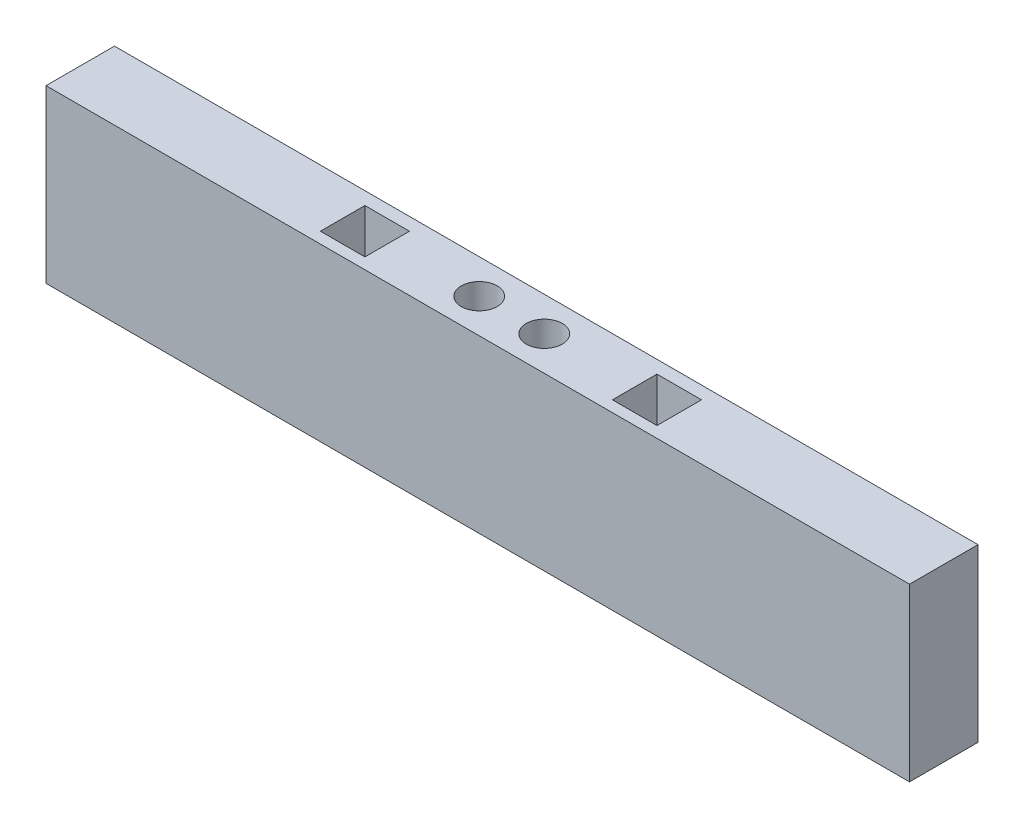
ISO-10303-21;
HEADER;
FILE_DESCRIPTION(('STEP AP214'),'2;1');
FILE_NAME('part.step','',(''),(''),'','','');
FILE_SCHEMA(('AUTOMOTIVE_DESIGN { 1 0 10303 214 1 1 1 1 }'));
ENDSEC;
DATA;
#1=APPLICATION_CONTEXT('core data for automotive mechanical design processes');
#2=APPLICATION_PROTOCOL_DEFINITION('international standard','automotive_design',2000,#1);
#3=PRODUCT_CONTEXT('',#1,'mechanical');
#4=PRODUCT('Part','Part','',(#3));
#5=PRODUCT_RELATED_PRODUCT_CATEGORY('part','',(#4));
#6=PRODUCT_DEFINITION_FORMATION('','',#4);
#7=PRODUCT_DEFINITION_CONTEXT('part definition',#1,'design');
#8=PRODUCT_DEFINITION('design','',#6,#7);
#9=PRODUCT_DEFINITION_SHAPE('','',#8);
#10=(LENGTH_UNIT() NAMED_UNIT(*) SI_UNIT(.MILLI.,.METRE.));
#11=(NAMED_UNIT(*) PLANE_ANGLE_UNIT() SI_UNIT($,.RADIAN.));
#12=(NAMED_UNIT(*) SI_UNIT($,.STERADIAN.) SOLID_ANGLE_UNIT());
#13=UNCERTAINTY_MEASURE_WITH_UNIT(LENGTH_MEASURE(1.E-05),#10,'distance_accuracy_value','');
#14=(GEOMETRIC_REPRESENTATION_CONTEXT(3) GLOBAL_UNCERTAINTY_ASSIGNED_CONTEXT((#13)) GLOBAL_UNIT_ASSIGNED_CONTEXT((#10,
#11,#12)) REPRESENTATION_CONTEXT('',''));
#15=CARTESIAN_POINT('',(0.,0.,0.));
#16=DIRECTION('',(0.,0.,1.));
#17=DIRECTION('',(1.,0.,0.));
#18=AXIS2_PLACEMENT_3D('',#15,#16,#17);
#19=CARTESIAN_POINT('',(-182.821386225128,92.090395480226,20.));
#20=DIRECTION('',(1.,0.,0.));
#21=DIRECTION('',(0.,0.,-1.));
#22=AXIS2_PLACEMENT_3D('',#19,#20,#21);
#23=PLANE('',#22);
#24=DIRECTION('',(0.,-1.,0.));
#25=VECTOR('',#24,1.);
#26=CARTESIAN_POINT('',(-182.821386225128,92.090395480226,0.));
#27=LINE('',#26,#25);
#28=CARTESIAN_POINT('',(-182.821386225128,92.090395480226,0.));
#29=VERTEX_POINT('',#28);
#30=CARTESIAN_POINT('',(-182.821386225128,42.090395480226,0.));
#31=VERTEX_POINT('',#30);
#32=EDGE_CURVE('E133',#29,#31,#27,.T.);
#33=ORIENTED_EDGE('',*,*,#32,.T.);
#34=DIRECTION('',(0.,0.,-1.));
#35=VECTOR('',#34,1.);
#36=CARTESIAN_POINT('',(-182.821386225128,42.090395480226,277.067033541267));
#37=LINE('',#36,#35);
#38=CARTESIAN_POINT('',(-182.821386225128,42.090395480226,20.));
#39=VERTEX_POINT('',#38);
#40=EDGE_CURVE('E119',#39,#31,#37,.T.);
#41=ORIENTED_EDGE('',*,*,#40,.F.);
#42=DIRECTION('',(0.,-1.,0.));
#43=VECTOR('',#42,1.);
#44=CARTESIAN_POINT('',(-182.821386225128,92.090395480226,20.));
#45=LINE('',#44,#43);
#46=CARTESIAN_POINT('',(-182.821386225128,92.090395480226,20.));
#47=VERTEX_POINT('',#46);
#48=EDGE_CURVE('E40',#47,#39,#45,.T.);
#49=ORIENTED_EDGE('',*,*,#48,.F.);
#50=DIRECTION('',(0.,0.,-1.));
#51=VECTOR('',#50,1.);
#52=CARTESIAN_POINT('',(-182.821386225128,92.090395480226,20.));
#53=LINE('',#52,#51);
#54=EDGE_CURVE('E11',#47,#29,#53,.T.);
#55=ORIENTED_EDGE('',*,*,#54,.T.);
#56=EDGE_LOOP('',(#33,#41,#49,#55));
#57=FACE_BOUND('',#56,.T.);
#58=ADVANCED_FACE('F33',(#57),#23,.F.);
#59=CARTESIAN_POINT('',(-107.821386225128,92.090395480226,20.));
#60=DIRECTION('',(0.,-1.,0.));
#61=DIRECTION('',(1.,0.,0.));
#62=AXIS2_PLACEMENT_3D('',#59,#60,#61);
#63=PLANE('',#62);
#64=DIRECTION('',(-1.,0.,0.));
#65=VECTOR('',#64,1.);
#66=CARTESIAN_POINT('',(-7.66377731017402,92.090395480226,3.75));
#67=LINE('',#66,#65);
#68=CARTESIAN_POINT('',(-7.66377731017402,92.090395480226,3.75));
#69=VERTEX_POINT('',#68);
#70=CARTESIAN_POINT('',(-20.663777310174,92.090395480226,3.75));
#71=VERTEX_POINT('',#70);
#72=EDGE_CURVE('E203',#69,#71,#67,.T.);
#73=ORIENTED_EDGE('',*,*,#72,.F.);
#74=DIRECTION('',(0.,0.,-1.));
#75=VECTOR('',#74,1.);
#76=CARTESIAN_POINT('',(-7.66377731017402,92.090395480226,3.75));
#77=LINE('',#76,#75);
#78=CARTESIAN_POINT('',(-7.66377731017402,92.090395480226,16.75));
#79=VERTEX_POINT('',#78);
#80=EDGE_CURVE('E55',#79,#69,#77,.T.);
#81=ORIENTED_EDGE('',*,*,#80,.F.);
#82=DIRECTION('',(1.,0.,0.));
#83=VECTOR('',#82,1.);
#84=CARTESIAN_POINT('',(-7.66377731017402,92.090395480226,16.75));
#85=LINE('',#84,#83);
#86=CARTESIAN_POINT('',(-20.663777310174,92.090395480226,16.75));
#87=VERTEX_POINT('',#86);
#88=EDGE_CURVE('E196',#87,#79,#85,.T.);
#89=ORIENTED_EDGE('',*,*,#88,.F.);
#90=DIRECTION('',(0.,0.,1.));
#91=VECTOR('',#90,1.);
#92=CARTESIAN_POINT('',(-20.663777310174,92.090395480226,3.75));
#93=LINE('',#92,#91);
#94=EDGE_CURVE('E200',#71,#87,#93,.T.);
#95=ORIENTED_EDGE('',*,*,#94,.F.);
#96=EDGE_LOOP('',(#73,#81,#89,#95));
#97=FACE_BOUND('',#96,.T.);
#98=DIRECTION('',(1.,0.,0.));
#99=VECTOR('',#98,1.);
#100=CARTESIAN_POINT('',(-105.941386225128,92.090395480226,16.75));
#101=LINE('',#100,#99);
#102=CARTESIAN_POINT('',(-105.941386225128,92.090395480226,16.75));
#103=VERTEX_POINT('',#102);
#104=CARTESIAN_POINT('',(-92.9413862251281,92.090395480226,16.75));
#105=VERTEX_POINT('',#104);
#106=EDGE_CURVE('E172',#103,#105,#101,.T.);
#107=ORIENTED_EDGE('',*,*,#106,.F.);
#108=DIRECTION('',(0.,0.,1.));
#109=VECTOR('',#108,1.);
#110=CARTESIAN_POINT('',(-105.941386225128,92.090395480226,3.75));
#111=LINE('',#110,#109);
#112=CARTESIAN_POINT('',(-105.941386225128,92.090395480226,3.75));
#113=VERTEX_POINT('',#112);
#114=EDGE_CURVE('E175',#113,#103,#111,.T.);
#115=ORIENTED_EDGE('',*,*,#114,.F.);
#116=DIRECTION('',(-1.,0.,0.));
#117=VECTOR('',#116,1.);
#118=CARTESIAN_POINT('',(-105.941386225128,92.090395480226,3.75));
#119=LINE('',#118,#117);
#120=CARTESIAN_POINT('',(-92.9413862251281,92.090395480226,3.75));
#121=VERTEX_POINT('',#120);
#122=EDGE_CURVE('E165',#121,#113,#119,.T.);
#123=ORIENTED_EDGE('',*,*,#122,.F.);
#124=DIRECTION('',(0.,0.,-1.));
#125=VECTOR('',#124,1.);
#126=CARTESIAN_POINT('',(-92.9413862251281,92.090395480226,3.75));
#127=LINE('',#126,#125);
#128=EDGE_CURVE('E169',#105,#121,#127,.T.);
#129=ORIENTED_EDGE('',*,*,#128,.F.);
#130=EDGE_LOOP('',(#107,#115,#123,#129));
#131=FACE_BOUND('',#130,.T.);
#132=CARTESIAN_POINT('',(-47.3213862251281,92.090395480226,10.));
#133=DIRECTION('',(0.,1.,0.));
#134=DIRECTION('',(-1.,0.,0.));
#135=AXIS2_PLACEMENT_3D('',#132,#133,#134);
#136=CIRCLE('',#135,5.25);
#137=CARTESIAN_POINT('',(-52.5713862251281,92.090395480226,10.));
#138=VERTEX_POINT('',#137);
#139=EDGE_CURVE('E150',#138,#138,#136,.T.);
#140=ORIENTED_EDGE('',*,*,#139,.F.);
#141=EDGE_LOOP('',(#140));
#142=FACE_BOUND('',#141,.T.);
#143=CARTESIAN_POINT('',(-66.3213862251281,92.090395480226,10.));
#144=DIRECTION('',(0.,1.,0.));
#145=DIRECTION('',(-1.,0.,0.));
#146=AXIS2_PLACEMENT_3D('',#143,#144,#145);
#147=CIRCLE('',#146,5.25);
#148=CARTESIAN_POINT('',(-71.5713862251281,92.090395480226,10.));
#149=VERTEX_POINT('',#148);
#150=EDGE_CURVE('E142',#149,#149,#147,.T.);
#151=ORIENTED_EDGE('',*,*,#150,.F.);
#152=EDGE_LOOP('',(#151));
#153=FACE_BOUND('',#152,.T.);
#154=DIRECTION('',(-1.,0.,0.));
#155=VECTOR('',#154,1.);
#156=CARTESIAN_POINT('',(-107.821386225128,92.090395480226,20.));
#157=LINE('',#156,#155);
#158=CARTESIAN_POINT('',(69.336222689826,92.0903954802261,20.));
#159=VERTEX_POINT('',#158);
#160=EDGE_CURVE('E140',#159,#47,#157,.T.);
#161=ORIENTED_EDGE('',*,*,#160,.F.);
#162=DIRECTION('',(0.,0.,1.));
#163=VECTOR('',#162,1.);
#164=CARTESIAN_POINT('',(69.336222689826,92.0903954802261,20.));
#165=LINE('',#164,#163);
#166=CARTESIAN_POINT('',(69.336222689826,92.0903954802261,0.));
#167=VERTEX_POINT('',#166);
#168=EDGE_CURVE('E219',#167,#159,#165,.T.);
#169=ORIENTED_EDGE('',*,*,#168,.F.);
#170=DIRECTION('',(-1.,0.,0.));
#171=VECTOR('',#170,1.);
#172=CARTESIAN_POINT('',(-107.821386225128,92.090395480226,0.));
#173=LINE('',#172,#171);
#174=EDGE_CURVE('E137',#167,#29,#173,.T.);
#175=ORIENTED_EDGE('',*,*,#174,.T.);
#176=ORIENTED_EDGE('',*,*,#54,.F.);
#177=EDGE_LOOP('',(#161,#169,#175,#176));
#178=FACE_BOUND('',#177,.T.);
#179=ADVANCED_FACE('F233',(#97,#131,#142,#153,#178),#63,.F.);
#180=CARTESIAN_POINT('',(0.,0.,20.));
#181=DIRECTION('',(0.,0.,1.));
#182=DIRECTION('',(1.,0.,0.));
#183=AXIS2_PLACEMENT_3D('',#180,#181,#182);
#184=PLANE('',#183);
#185=DIRECTION('',(1.,0.,0.));
#186=VECTOR('',#185,1.);
#187=CARTESIAN_POINT('',(69.336222689826,42.090395480226,20.));
#188=LINE('',#187,#186);
#189=CARTESIAN_POINT('',(69.336222689826,42.090395480226,20.));
#190=VERTEX_POINT('',#189);
#191=EDGE_CURVE('E122',#39,#190,#188,.T.);
#192=ORIENTED_EDGE('',*,*,#191,.T.);
#193=DIRECTION('',(0.,1.,0.));
#194=VECTOR('',#193,1.);
#195=CARTESIAN_POINT('',(69.336222689826,-57.909604519774,20.));
#196=LINE('',#195,#194);
#197=EDGE_CURVE('E217',#190,#159,#196,.T.);
#198=ORIENTED_EDGE('',*,*,#197,.T.);
#199=ORIENTED_EDGE('',*,*,#160,.T.);
#200=ORIENTED_EDGE('',*,*,#48,.T.);
#201=EDGE_LOOP('',(#192,#198,#199,#200));
#202=FACE_BOUND('',#201,.T.);
#203=ADVANCED_FACE('F227',(#202),#184,.T.);
#204=CARTESIAN_POINT('',(0.,0.,0.));
#205=DIRECTION('',(0.,0.,1.));
#206=DIRECTION('',(1.,0.,0.));
#207=AXIS2_PLACEMENT_3D('',#204,#205,#206);
#208=PLANE('',#207);
#209=DIRECTION('',(0.,1.,0.));
#210=VECTOR('',#209,1.);
#211=CARTESIAN_POINT('',(69.336222689826,-57.909604519774,0.));
#212=LINE('',#211,#210);
#213=CARTESIAN_POINT('',(69.336222689826,42.090395480226,0.));
#214=VERTEX_POINT('',#213);
#215=EDGE_CURVE('E134',#214,#167,#212,.T.);
#216=ORIENTED_EDGE('',*,*,#215,.F.);
#217=DIRECTION('',(1.,0.,0.));
#218=VECTOR('',#217,1.);
#219=CARTESIAN_POINT('',(69.336222689826,42.090395480226,0.));
#220=LINE('',#219,#218);
#221=EDGE_CURVE('E47',#31,#214,#220,.T.);
#222=ORIENTED_EDGE('',*,*,#221,.F.);
#223=ORIENTED_EDGE('',*,*,#32,.F.);
#224=ORIENTED_EDGE('',*,*,#174,.F.);
#225=EDGE_LOOP('',(#216,#222,#223,#224));
#226=FACE_BOUND('',#225,.T.);
#227=ADVANCED_FACE('F131',(#226),#208,.F.);
#228=CARTESIAN_POINT('',(-66.3213862251281,72.090395480226,10.));
#229=DIRECTION('',(0.,1.,0.));
#230=DIRECTION('',(-1.,0.,0.));
#231=AXIS2_PLACEMENT_3D('',#228,#229,#230);
#232=CYLINDRICAL_SURFACE('',#231,5.25);
#233=CARTESIAN_POINT('',(-66.3213862251281,72.090395480226,10.));
#234=DIRECTION('',(0.,1.,0.));
#235=DIRECTION('',(-1.,0.,0.));
#236=AXIS2_PLACEMENT_3D('',#233,#234,#235);
#237=CIRCLE('',#236,5.25);
#238=CARTESIAN_POINT('',(-71.5713862251281,72.090395480226,10.));
#239=VERTEX_POINT('',#238);
#240=EDGE_CURVE('E138',#239,#239,#237,.T.);
#241=ORIENTED_EDGE('',*,*,#240,.F.);
#242=EDGE_LOOP('',(#241));
#243=FACE_BOUND('',#242,.T.);
#244=ORIENTED_EDGE('',*,*,#150,.T.);
#245=EDGE_LOOP('',(#244));
#246=FACE_BOUND('',#245,.T.);
#247=ADVANCED_FACE('F247',(#243,#246),#232,.F.);
#248=CARTESIAN_POINT('',(-66.3213862251281,72.090395480226,10.));
#249=DIRECTION('',(0.,1.,0.));
#250=DIRECTION('',(-1.,0.,0.));
#251=AXIS2_PLACEMENT_3D('',#248,#249,#250);
#252=PLANE('',#251);
#253=ORIENTED_EDGE('',*,*,#240,.T.);
#254=EDGE_LOOP('',(#253));
#255=FACE_BOUND('',#254,.T.);
#256=ADVANCED_FACE('F251',(#255),#252,.T.);
#257=CARTESIAN_POINT('',(-47.3213862251281,72.090395480226,10.));
#258=DIRECTION('',(0.,1.,0.));
#259=DIRECTION('',(-1.,0.,0.));
#260=AXIS2_PLACEMENT_3D('',#257,#258,#259);
#261=CYLINDRICAL_SURFACE('',#260,5.25);
#262=CARTESIAN_POINT('',(-47.3213862251281,72.090395480226,10.));
#263=DIRECTION('',(0.,1.,0.));
#264=DIRECTION('',(-1.,0.,0.));
#265=AXIS2_PLACEMENT_3D('',#262,#263,#264);
#266=CIRCLE('',#265,5.25);
#267=CARTESIAN_POINT('',(-52.5713862251281,72.090395480226,10.));
#268=VERTEX_POINT('',#267);
#269=EDGE_CURVE('E148',#268,#268,#266,.T.);
#270=ORIENTED_EDGE('',*,*,#269,.F.);
#271=EDGE_LOOP('',(#270));
#272=FACE_BOUND('',#271,.T.);
#273=ORIENTED_EDGE('',*,*,#139,.T.);
#274=EDGE_LOOP('',(#273));
#275=FACE_BOUND('',#274,.T.);
#276=ADVANCED_FACE('F255',(#272,#275),#261,.F.);
#277=CARTESIAN_POINT('',(-47.3213862251281,72.090395480226,10.));
#278=DIRECTION('',(0.,1.,0.));
#279=DIRECTION('',(-1.,0.,0.));
#280=AXIS2_PLACEMENT_3D('',#277,#278,#279);
#281=PLANE('',#280);
#282=ORIENTED_EDGE('',*,*,#269,.T.);
#283=EDGE_LOOP('',(#282));
#284=FACE_BOUND('',#283,.T.);
#285=ADVANCED_FACE('F259',(#284),#281,.T.);
#286=CARTESIAN_POINT('',(-105.941386225128,76.590395480226,3.75));
#287=DIRECTION('',(-1.,0.,0.));
#288=DIRECTION('',(0.,-1.,0.));
#289=AXIS2_PLACEMENT_3D('',#286,#287,#288);
#290=PLANE('',#289);
#291=ORIENTED_EDGE('',*,*,#114,.T.);
#292=DIRECTION('',(0.,1.,0.));
#293=VECTOR('',#292,1.);
#294=CARTESIAN_POINT('',(-105.941386225128,76.590395480226,16.75));
#295=LINE('',#294,#293);
#296=CARTESIAN_POINT('',(-105.941386225128,76.590395480226,16.75));
#297=VERTEX_POINT('',#296);
#298=EDGE_CURVE('E156',#297,#103,#295,.T.);
#299=ORIENTED_EDGE('',*,*,#298,.F.);
#300=DIRECTION('',(0.,0.,1.));
#301=VECTOR('',#300,1.);
#302=CARTESIAN_POINT('',(-105.941386225128,76.590395480226,3.75));
#303=LINE('',#302,#301);
#304=CARTESIAN_POINT('',(-105.941386225128,76.590395480226,3.75));
#305=VERTEX_POINT('',#304);
#306=EDGE_CURVE('E168',#305,#297,#303,.T.);
#307=ORIENTED_EDGE('',*,*,#306,.F.);
#308=DIRECTION('',(0.,1.,0.));
#309=VECTOR('',#308,1.);
#310=CARTESIAN_POINT('',(-105.941386225128,76.590395480226,3.75));
#311=LINE('',#310,#309);
#312=EDGE_CURVE('E153',#305,#113,#311,.T.);
#313=ORIENTED_EDGE('',*,*,#312,.T.);
#314=EDGE_LOOP('',(#291,#299,#307,#313));
#315=FACE_BOUND('',#314,.T.);
#316=ADVANCED_FACE('F263',(#315),#290,.F.);
#317=CARTESIAN_POINT('',(-105.941386225128,76.590395480226,3.75));
#318=DIRECTION('',(0.,0.,-1.));
#319=DIRECTION('',(-1.,0.,0.));
#320=AXIS2_PLACEMENT_3D('',#317,#318,#319);
#321=PLANE('',#320);
#322=ORIENTED_EDGE('',*,*,#122,.T.);
#323=ORIENTED_EDGE('',*,*,#312,.F.);
#324=DIRECTION('',(-1.,0.,0.));
#325=VECTOR('',#324,1.);
#326=CARTESIAN_POINT('',(-105.941386225128,76.590395480226,3.75));
#327=LINE('',#326,#325);
#328=CARTESIAN_POINT('',(-92.9413862251281,76.590395480226,3.75));
#329=VERTEX_POINT('',#328);
#330=EDGE_CURVE('E160',#329,#305,#327,.T.);
#331=ORIENTED_EDGE('',*,*,#330,.F.);
#332=DIRECTION('',(0.,1.,0.));
#333=VECTOR('',#332,1.);
#334=CARTESIAN_POINT('',(-92.9413862251281,76.590395480226,3.75));
#335=LINE('',#334,#333);
#336=EDGE_CURVE('E162',#329,#121,#335,.T.);
#337=ORIENTED_EDGE('',*,*,#336,.T.);
#338=EDGE_LOOP('',(#322,#323,#331,#337));
#339=FACE_BOUND('',#338,.T.);
#340=ADVANCED_FACE('F267',(#339),#321,.F.);
#341=CARTESIAN_POINT('',(-92.9413862251281,76.590395480226,3.75));
#342=DIRECTION('',(1.,0.,0.));
#343=DIRECTION('',(0.,1.,0.));
#344=AXIS2_PLACEMENT_3D('',#341,#342,#343);
#345=PLANE('',#344);
#346=ORIENTED_EDGE('',*,*,#128,.T.);
#347=ORIENTED_EDGE('',*,*,#336,.F.);
#348=DIRECTION('',(0.,0.,-1.));
#349=VECTOR('',#348,1.);
#350=CARTESIAN_POINT('',(-92.9413862251281,76.590395480226,3.75));
#351=LINE('',#350,#349);
#352=CARTESIAN_POINT('',(-92.9413862251281,76.590395480226,16.75));
#353=VERTEX_POINT('',#352);
#354=EDGE_CURVE('E180',#353,#329,#351,.T.);
#355=ORIENTED_EDGE('',*,*,#354,.F.);
#356=DIRECTION('',(0.,1.,0.));
#357=VECTOR('',#356,1.);
#358=CARTESIAN_POINT('',(-92.9413862251281,76.590395480226,16.75));
#359=LINE('',#358,#357);
#360=EDGE_CURVE('E159',#353,#105,#359,.T.);
#361=ORIENTED_EDGE('',*,*,#360,.T.);
#362=EDGE_LOOP('',(#346,#347,#355,#361));
#363=FACE_BOUND('',#362,.T.);
#364=ADVANCED_FACE('F273',(#363),#345,.F.);
#365=CARTESIAN_POINT('',(-105.941386225128,76.590395480226,16.75));
#366=DIRECTION('',(0.,0.,1.));
#367=DIRECTION('',(1.,0.,0.));
#368=AXIS2_PLACEMENT_3D('',#365,#366,#367);
#369=PLANE('',#368);
#370=ORIENTED_EDGE('',*,*,#106,.T.);
#371=ORIENTED_EDGE('',*,*,#360,.F.);
#372=DIRECTION('',(1.,0.,0.));
#373=VECTOR('',#372,1.);
#374=CARTESIAN_POINT('',(-105.941386225128,76.590395480226,16.75));
#375=LINE('',#374,#373);
#376=EDGE_CURVE('E183',#297,#353,#375,.T.);
#377=ORIENTED_EDGE('',*,*,#376,.F.);
#378=ORIENTED_EDGE('',*,*,#298,.T.);
#379=EDGE_LOOP('',(#370,#371,#377,#378));
#380=FACE_BOUND('',#379,.T.);
#381=ADVANCED_FACE('F269',(#380),#369,.F.);
#382=CARTESIAN_POINT('',(0.,76.590395480226,0.));
#383=DIRECTION('',(0.,1.,0.));
#384=DIRECTION('',(0.,0.,1.));
#385=AXIS2_PLACEMENT_3D('',#382,#383,#384);
#386=PLANE('',#385);
#387=ORIENTED_EDGE('',*,*,#306,.T.);
#388=ORIENTED_EDGE('',*,*,#376,.T.);
#389=ORIENTED_EDGE('',*,*,#354,.T.);
#390=ORIENTED_EDGE('',*,*,#330,.T.);
#391=EDGE_LOOP('',(#387,#388,#389,#390));
#392=FACE_BOUND('',#391,.T.);
#393=ADVANCED_FACE('F272',(#392),#386,.T.);
#394=CARTESIAN_POINT('',(-7.66377731017401,76.590395480226,3.75));
#395=DIRECTION('',(1.,0.,0.));
#396=DIRECTION('',(0.,1.,0.));
#397=AXIS2_PLACEMENT_3D('',#394,#395,#396);
#398=PLANE('',#397);
#399=ORIENTED_EDGE('',*,*,#80,.T.);
#400=DIRECTION('',(0.,1.,0.));
#401=VECTOR('',#400,1.);
#402=CARTESIAN_POINT('',(-7.66377731017401,76.590395480226,3.75));
#403=LINE('',#402,#401);
#404=CARTESIAN_POINT('',(-7.66377731017401,76.590395480226,3.75));
#405=VERTEX_POINT('',#404);
#406=EDGE_CURVE('E188',#405,#69,#403,.T.);
#407=ORIENTED_EDGE('',*,*,#406,.F.);
#408=DIRECTION('',(0.,0.,-1.));
#409=VECTOR('',#408,1.);
#410=CARTESIAN_POINT('',(-7.66377731017401,76.590395480226,3.75));
#411=LINE('',#410,#409);
#412=CARTESIAN_POINT('',(-7.66377731017401,76.590395480226,16.75));
#413=VERTEX_POINT('',#412);
#414=EDGE_CURVE('E199',#413,#405,#411,.T.);
#415=ORIENTED_EDGE('',*,*,#414,.F.);
#416=DIRECTION('',(0.,1.,0.));
#417=VECTOR('',#416,1.);
#418=CARTESIAN_POINT('',(-7.66377731017401,76.590395480226,16.75));
#419=LINE('',#418,#417);
#420=EDGE_CURVE('E177',#413,#79,#419,.T.);
#421=ORIENTED_EDGE('',*,*,#420,.T.);
#422=EDGE_LOOP('',(#399,#407,#415,#421));
#423=FACE_BOUND('',#422,.T.);
#424=ADVANCED_FACE('F283',(#423),#398,.F.);
#425=CARTESIAN_POINT('',(-7.66377731017401,76.590395480226,16.75));
#426=DIRECTION('',(0.,0.,1.));
#427=DIRECTION('',(1.,0.,0.));
#428=AXIS2_PLACEMENT_3D('',#425,#426,#427);
#429=PLANE('',#428);
#430=ORIENTED_EDGE('',*,*,#88,.T.);
#431=ORIENTED_EDGE('',*,*,#420,.F.);
#432=DIRECTION('',(1.,0.,0.));
#433=VECTOR('',#432,1.);
#434=CARTESIAN_POINT('',(-7.66377731017401,76.590395480226,16.75));
#435=LINE('',#434,#433);
#436=CARTESIAN_POINT('',(-20.663777310174,76.590395480226,16.75));
#437=VERTEX_POINT('',#436);
#438=EDGE_CURVE('E191',#437,#413,#435,.T.);
#439=ORIENTED_EDGE('',*,*,#438,.F.);
#440=DIRECTION('',(0.,1.,0.));
#441=VECTOR('',#440,1.);
#442=CARTESIAN_POINT('',(-20.663777310174,76.590395480226,16.75));
#443=LINE('',#442,#441);
#444=EDGE_CURVE('E193',#437,#87,#443,.T.);
#445=ORIENTED_EDGE('',*,*,#444,.T.);
#446=EDGE_LOOP('',(#430,#431,#439,#445));
#447=FACE_BOUND('',#446,.T.);
#448=ADVANCED_FACE('F287',(#447),#429,.F.);
#449=CARTESIAN_POINT('',(-20.663777310174,76.590395480226,3.75));
#450=DIRECTION('',(-1.,0.,0.));
#451=DIRECTION('',(0.,-1.,0.));
#452=AXIS2_PLACEMENT_3D('',#449,#450,#451);
#453=PLANE('',#452);
#454=ORIENTED_EDGE('',*,*,#94,.T.);
#455=ORIENTED_EDGE('',*,*,#444,.F.);
#456=DIRECTION('',(0.,0.,1.));
#457=VECTOR('',#456,1.);
#458=CARTESIAN_POINT('',(-20.663777310174,76.590395480226,3.75));
#459=LINE('',#458,#457);
#460=CARTESIAN_POINT('',(-20.663777310174,76.590395480226,3.75));
#461=VERTEX_POINT('',#460);
#462=EDGE_CURVE('E209',#461,#437,#459,.T.);
#463=ORIENTED_EDGE('',*,*,#462,.F.);
#464=DIRECTION('',(0.,1.,0.));
#465=VECTOR('',#464,1.);
#466=CARTESIAN_POINT('',(-20.663777310174,76.590395480226,3.75));
#467=LINE('',#466,#465);
#468=EDGE_CURVE('E190',#461,#71,#467,.T.);
#469=ORIENTED_EDGE('',*,*,#468,.T.);
#470=EDGE_LOOP('',(#454,#455,#463,#469));
#471=FACE_BOUND('',#470,.T.);
#472=ADVANCED_FACE('F292',(#471),#453,.F.);
#473=CARTESIAN_POINT('',(-7.66377731017401,76.590395480226,3.75));
#474=DIRECTION('',(0.,0.,-1.));
#475=DIRECTION('',(-1.,0.,0.));
#476=AXIS2_PLACEMENT_3D('',#473,#474,#475);
#477=PLANE('',#476);
#478=ORIENTED_EDGE('',*,*,#72,.T.);
#479=ORIENTED_EDGE('',*,*,#468,.F.);
#480=DIRECTION('',(-1.,0.,0.));
#481=VECTOR('',#480,1.);
#482=CARTESIAN_POINT('',(-7.66377731017401,76.590395480226,3.75));
#483=LINE('',#482,#481);
#484=EDGE_CURVE('E212',#405,#461,#483,.T.);
#485=ORIENTED_EDGE('',*,*,#484,.F.);
#486=ORIENTED_EDGE('',*,*,#406,.T.);
#487=EDGE_LOOP('',(#478,#479,#485,#486));
#488=FACE_BOUND('',#487,.T.);
#489=ADVANCED_FACE('F288',(#488),#477,.F.);
#490=CARTESIAN_POINT('',(0.,76.590395480226,0.));
#491=DIRECTION('',(0.,-1.,0.));
#492=DIRECTION('',(0.,0.,-1.));
#493=AXIS2_PLACEMENT_3D('',#490,#491,#492);
#494=PLANE('',#493);
#495=ORIENTED_EDGE('',*,*,#414,.T.);
#496=ORIENTED_EDGE('',*,*,#484,.T.);
#497=ORIENTED_EDGE('',*,*,#462,.T.);
#498=ORIENTED_EDGE('',*,*,#438,.T.);
#499=EDGE_LOOP('',(#495,#496,#497,#498));
#500=FACE_BOUND('',#499,.T.);
#501=ADVANCED_FACE('F291',(#500),#494,.F.);
#502=CARTESIAN_POINT('',(69.336222689826,-57.909604519774,20.));
#503=DIRECTION('',(-1.,0.,0.));
#504=DIRECTION('',(0.,-1.,0.));
#505=AXIS2_PLACEMENT_3D('',#502,#503,#504);
#506=PLANE('',#505);
#507=ORIENTED_EDGE('',*,*,#197,.F.);
#508=DIRECTION('',(0.,0.,-1.));
#509=VECTOR('',#508,1.);
#510=CARTESIAN_POINT('',(69.336222689826,42.090395480226,277.067033541267));
#511=LINE('',#510,#509);
#512=EDGE_CURVE('E222',#190,#214,#511,.T.);
#513=ORIENTED_EDGE('',*,*,#512,.T.);
#514=ORIENTED_EDGE('',*,*,#215,.T.);
#515=ORIENTED_EDGE('',*,*,#168,.T.);
#516=EDGE_LOOP('',(#507,#513,#514,#515));
#517=FACE_BOUND('',#516,.T.);
#518=ADVANCED_FACE('F229',(#517),#506,.F.);
#519=CARTESIAN_POINT('',(69.336222689826,42.090395480226,277.067033541267));
#520=DIRECTION('',(0.,1.,0.));
#521=DIRECTION('',(0.,0.,1.));
#522=AXIS2_PLACEMENT_3D('',#519,#520,#521);
#523=PLANE('',#522);
#524=ORIENTED_EDGE('',*,*,#40,.T.);
#525=ORIENTED_EDGE('',*,*,#221,.T.);
#526=ORIENTED_EDGE('',*,*,#512,.F.);
#527=ORIENTED_EDGE('',*,*,#191,.F.);
#528=EDGE_LOOP('',(#524,#525,#526,#527));
#529=FACE_BOUND('',#528,.T.);
#530=ADVANCED_FACE('F120',(#529),#523,.F.);
#531=CLOSED_SHELL('',(#58,#179,#203,#227,#247,#256,#276,#285,#316,#340,#364,#381,#393,#424,#448,
#472,#489,#501,#518,#530));
#532=MANIFOLD_SOLID_BREP('B2',#531);
#533=ADVANCED_BREP_SHAPE_REPRESENTATION('',(#18,#532),#14);
#534=SHAPE_DEFINITION_REPRESENTATION(#9,#533);
ENDSEC;
END-ISO-10303-21;
